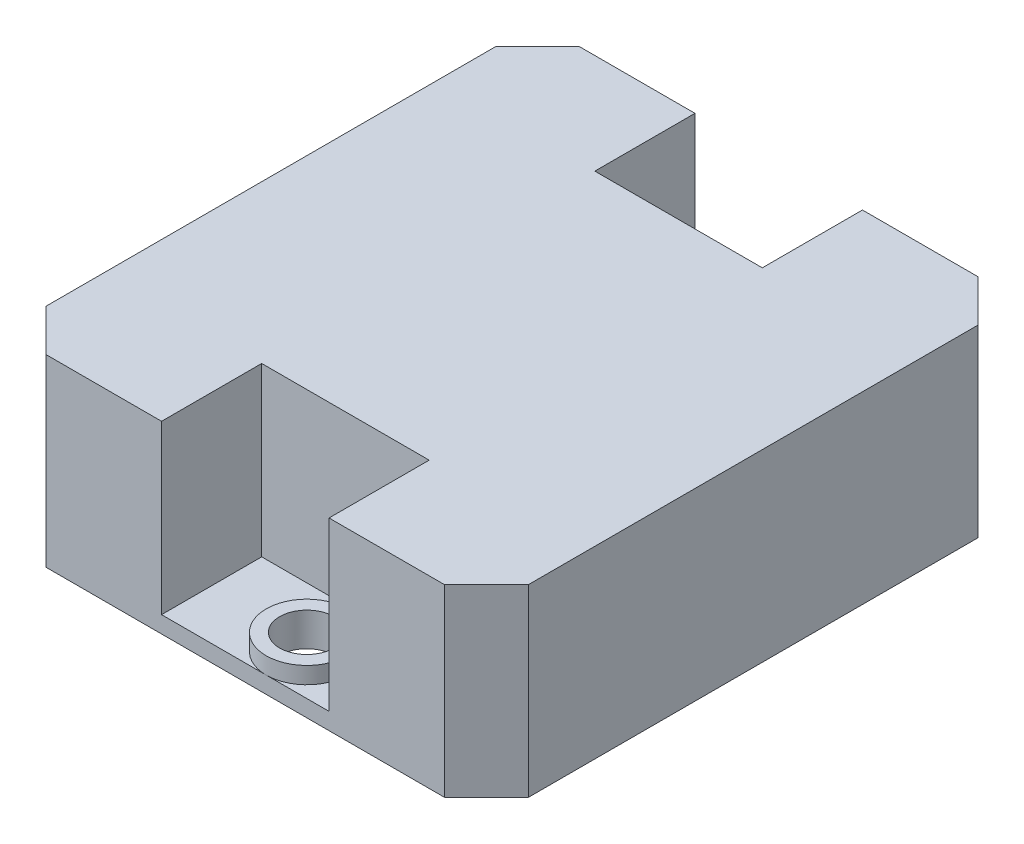
ISO-10303-21;
HEADER;
FILE_DESCRIPTION(('STEP AP214'),'2;1');
FILE_NAME('part.step','',(''),(''),'','','');
FILE_SCHEMA(('AUTOMOTIVE_DESIGN { 1 0 10303 214 1 1 1 1 }'));
ENDSEC;
DATA;
#1=APPLICATION_CONTEXT('core data for automotive mechanical design processes');
#2=APPLICATION_PROTOCOL_DEFINITION('international standard','automotive_design',2000,#1);
#3=PRODUCT_CONTEXT('',#1,'mechanical');
#4=PRODUCT('Part','Part','',(#3));
#5=PRODUCT_RELATED_PRODUCT_CATEGORY('part','',(#4));
#6=PRODUCT_DEFINITION_FORMATION('','',#4);
#7=PRODUCT_DEFINITION_CONTEXT('part definition',#1,'design');
#8=PRODUCT_DEFINITION('design','',#6,#7);
#9=PRODUCT_DEFINITION_SHAPE('','',#8);
#10=(LENGTH_UNIT() NAMED_UNIT(*) SI_UNIT(.MILLI.,.METRE.));
#11=(NAMED_UNIT(*) PLANE_ANGLE_UNIT() SI_UNIT($,.RADIAN.));
#12=(NAMED_UNIT(*) SI_UNIT($,.STERADIAN.) SOLID_ANGLE_UNIT());
#13=UNCERTAINTY_MEASURE_WITH_UNIT(LENGTH_MEASURE(1.E-05),#10,'distance_accuracy_value','');
#14=(GEOMETRIC_REPRESENTATION_CONTEXT(3) GLOBAL_UNCERTAINTY_ASSIGNED_CONTEXT((#13)) GLOBAL_UNIT_ASSIGNED_CONTEXT((#10,
#11,#12)) REPRESENTATION_CONTEXT('',''));
#15=CARTESIAN_POINT('',(0.,0.,0.));
#16=DIRECTION('',(0.,0.,1.));
#17=DIRECTION('',(1.,0.,0.));
#18=AXIS2_PLACEMENT_3D('',#15,#16,#17);
#19=CARTESIAN_POINT('',(2.5,22.,-27.));
#20=DIRECTION('',(0.,-1.,0.));
#21=DIRECTION('',(0.,0.,-1.));
#22=AXIS2_PLACEMENT_3D('',#19,#20,#21);
#23=CYLINDRICAL_SURFACE('',#22,3.25);
#24=CARTESIAN_POINT('',(2.5,0.,-27.));
#25=DIRECTION('',(0.,1.,0.));
#26=DIRECTION('',(0.,0.,1.));
#27=AXIS2_PLACEMENT_3D('',#24,#25,#26);
#28=CIRCLE('',#27,3.25);
#29=CARTESIAN_POINT('',(2.5,0.,-23.75));
#30=VERTEX_POINT('',#29);
#31=EDGE_CURVE('E215',#30,#30,#28,.T.);
#32=ORIENTED_EDGE('',*,*,#31,.F.);
#33=EDGE_LOOP('',(#32));
#34=FACE_BOUND('',#33,.T.);
#35=CARTESIAN_POINT('',(2.5,4.,-27.));
#36=DIRECTION('',(0.,1.,0.));
#37=DIRECTION('',(0.,0.,1.));
#38=AXIS2_PLACEMENT_3D('',#35,#36,#37);
#39=CIRCLE('',#38,3.25);
#40=CARTESIAN_POINT('',(2.5,4.,-23.75));
#41=VERTEX_POINT('',#40);
#42=EDGE_CURVE('E293',#41,#41,#39,.T.);
#43=ORIENTED_EDGE('',*,*,#42,.T.);
#44=EDGE_LOOP('',(#43));
#45=FACE_BOUND('',#44,.T.);
#46=ADVANCED_FACE('F37',(#34,#45),#23,.F.);
#47=CARTESIAN_POINT('',(2.5,22.,27.));
#48=DIRECTION('',(0.,-1.,0.));
#49=DIRECTION('',(0.,0.,-1.));
#50=AXIS2_PLACEMENT_3D('',#47,#48,#49);
#51=CYLINDRICAL_SURFACE('',#50,3.25);
#52=CARTESIAN_POINT('',(2.5,0.,27.));
#53=DIRECTION('',(0.,1.,0.));
#54=DIRECTION('',(0.,0.,-1.));
#55=AXIS2_PLACEMENT_3D('',#52,#53,#54);
#56=CIRCLE('',#55,3.25);
#57=CARTESIAN_POINT('',(2.5,0.,23.75));
#58=VERTEX_POINT('',#57);
#59=EDGE_CURVE('E189',#58,#58,#56,.T.);
#60=ORIENTED_EDGE('',*,*,#59,.F.);
#61=EDGE_LOOP('',(#60));
#62=FACE_BOUND('',#61,.T.);
#63=CARTESIAN_POINT('',(2.5,4.,27.));
#64=DIRECTION('',(0.,1.,0.));
#65=DIRECTION('',(0.,0.,1.));
#66=AXIS2_PLACEMENT_3D('',#63,#64,#65);
#67=CIRCLE('',#66,3.25);
#68=CARTESIAN_POINT('',(2.5,4.,30.25));
#69=VERTEX_POINT('',#68);
#70=EDGE_CURVE('E193',#69,#69,#67,.T.);
#71=ORIENTED_EDGE('',*,*,#70,.T.);
#72=EDGE_LOOP('',(#71));
#73=FACE_BOUND('',#72,.T.);
#74=ADVANCED_FACE('F379',(#62,#73),#51,.F.);
#75=CARTESIAN_POINT('',(2.5,2.,27.));
#76=DIRECTION('',(0.,1.,0.));
#77=DIRECTION('',(0.,0.,1.));
#78=AXIS2_PLACEMENT_3D('',#75,#76,#77);
#79=CYLINDRICAL_SURFACE('',#78,4.85000000000001);
#80=CARTESIAN_POINT('',(2.5,2.,27.));
#81=DIRECTION('',(0.,1.,0.));
#82=DIRECTION('',(0.,0.,1.));
#83=AXIS2_PLACEMENT_3D('',#80,#81,#82);
#84=CIRCLE('',#83,4.85000000000001);
#85=CARTESIAN_POINT('',(2.5,2.,31.85));
#86=VERTEX_POINT('',#85);
#87=EDGE_CURVE('E186',#86,#86,#84,.T.);
#88=ORIENTED_EDGE('',*,*,#87,.T.);
#89=EDGE_LOOP('',(#88));
#90=FACE_BOUND('',#89,.T.);
#91=CARTESIAN_POINT('',(2.5,4.,27.));
#92=DIRECTION('',(0.,1.,0.));
#93=DIRECTION('',(0.,0.,1.));
#94=AXIS2_PLACEMENT_3D('',#91,#92,#93);
#95=CIRCLE('',#94,4.85000000000001);
#96=CARTESIAN_POINT('',(2.5,4.,31.85));
#97=VERTEX_POINT('',#96);
#98=EDGE_CURVE('E41',#97,#97,#95,.F.);
#99=ORIENTED_EDGE('',*,*,#98,.T.);
#100=EDGE_LOOP('',(#99));
#101=FACE_BOUND('',#100,.T.);
#102=ADVANCED_FACE('F305',(#90,#101),#79,.T.);
#103=CARTESIAN_POINT('',(2.5,2.,-27.));
#104=DIRECTION('',(0.,1.,0.));
#105=DIRECTION('',(0.,0.,1.));
#106=AXIS2_PLACEMENT_3D('',#103,#104,#105);
#107=CYLINDRICAL_SURFACE('',#106,4.85);
#108=CARTESIAN_POINT('',(2.5,2.,-27.));
#109=DIRECTION('',(0.,1.,0.));
#110=DIRECTION('',(0.,0.,1.));
#111=AXIS2_PLACEMENT_3D('',#108,#109,#110);
#112=CIRCLE('',#111,4.85);
#113=CARTESIAN_POINT('',(2.5,2.,-31.85));
#114=VERTEX_POINT('',#113);
#115=EDGE_CURVE('E54',#114,#114,#112,.T.);
#116=ORIENTED_EDGE('',*,*,#115,.T.);
#117=EDGE_LOOP('',(#116));
#118=FACE_BOUND('',#117,.T.);
#119=CARTESIAN_POINT('',(2.5,4.,-27.));
#120=DIRECTION('',(0.,1.,0.));
#121=DIRECTION('',(0.,0.,1.));
#122=AXIS2_PLACEMENT_3D('',#119,#120,#121);
#123=CIRCLE('',#122,4.85);
#124=CARTESIAN_POINT('',(2.5,4.,-22.15));
#125=VERTEX_POINT('',#124);
#126=EDGE_CURVE('E291',#125,#125,#123,.F.);
#127=ORIENTED_EDGE('',*,*,#126,.T.);
#128=EDGE_LOOP('',(#127));
#129=FACE_BOUND('',#128,.T.);
#130=ADVANCED_FACE('F392',(#118,#129),#107,.T.);
#131=CARTESIAN_POINT('',(0.,22.,0.));
#132=DIRECTION('',(0.,-1.,0.));
#133=DIRECTION('',(0.,0.,-1.));
#134=AXIS2_PLACEMENT_3D('',#131,#132,#133);
#135=PLANE('',#134);
#136=DIRECTION('',(1.,0.,0.));
#137=VECTOR('',#136,1.);
#138=CARTESIAN_POINT('',(-23.8,22.,31.85));
#139=LINE('',#138,#137);
#140=CARTESIAN_POINT('',(-23.8,22.,31.85));
#141=VERTEX_POINT('',#140);
#142=CARTESIAN_POINT('',(-10.,22.,31.85));
#143=VERTEX_POINT('',#142);
#144=EDGE_CURVE('E230',#141,#143,#139,.T.);
#145=ORIENTED_EDGE('',*,*,#144,.T.);
#146=DIRECTION('',(0.,0.,1.));
#147=VECTOR('',#146,1.);
#148=CARTESIAN_POINT('',(-10.,22.,31.85));
#149=LINE('',#148,#147);
#150=CARTESIAN_POINT('',(-10.,22.,19.8914949727031));
#151=VERTEX_POINT('',#150);
#152=EDGE_CURVE('E167',#151,#143,#149,.T.);
#153=ORIENTED_EDGE('',*,*,#152,.F.);
#154=DIRECTION('',(-1.,0.,0.));
#155=VECTOR('',#154,1.);
#156=CARTESIAN_POINT('',(-10.,22.,19.8914949727031));
#157=LINE('',#156,#155);
#158=CARTESIAN_POINT('',(10.,22.,19.8914949727031));
#159=VERTEX_POINT('',#158);
#160=EDGE_CURVE('E185',#159,#151,#157,.T.);
#161=ORIENTED_EDGE('',*,*,#160,.F.);
#162=DIRECTION('',(0.,0.,-1.));
#163=VECTOR('',#162,1.);
#164=CARTESIAN_POINT('',(10.,22.,19.8914949727031));
#165=LINE('',#164,#163);
#166=CARTESIAN_POINT('',(10.,22.,31.85));
#167=VERTEX_POINT('',#166);
#168=EDGE_CURVE('E173',#167,#159,#165,.T.);
#169=ORIENTED_EDGE('',*,*,#168,.F.);
#170=CARTESIAN_POINT('',(23.8,22.,31.85));
#171=VERTEX_POINT('',#170);
#172=EDGE_CURVE('E229',#167,#171,#139,.T.);
#173=ORIENTED_EDGE('',*,*,#172,.T.);
#174=DIRECTION('',(0.707106781186548,0.,-0.707106781186548));
#175=VECTOR('',#174,1.);
#176=CARTESIAN_POINT('',(23.8,22.,31.85));
#177=LINE('',#176,#175);
#178=CARTESIAN_POINT('',(28.8,22.,26.85));
#179=VERTEX_POINT('',#178);
#180=EDGE_CURVE('E233',#171,#179,#177,.T.);
#181=ORIENTED_EDGE('',*,*,#180,.T.);
#182=DIRECTION('',(0.,0.,-1.));
#183=VECTOR('',#182,1.);
#184=CARTESIAN_POINT('',(28.8,22.,-26.85));
#185=LINE('',#184,#183);
#186=CARTESIAN_POINT('',(28.8,22.,-26.85));
#187=VERTEX_POINT('',#186);
#188=EDGE_CURVE('E235',#179,#187,#185,.T.);
#189=ORIENTED_EDGE('',*,*,#188,.T.);
#190=DIRECTION('',(-0.707106781186548,0.,-0.707106781186548));
#191=VECTOR('',#190,1.);
#192=CARTESIAN_POINT('',(23.8,22.,-31.85));
#193=LINE('',#192,#191);
#194=CARTESIAN_POINT('',(23.8,22.,-31.85));
#195=VERTEX_POINT('',#194);
#196=EDGE_CURVE('E237',#187,#195,#193,.T.);
#197=ORIENTED_EDGE('',*,*,#196,.T.);
#198=DIRECTION('',(-1.,0.,0.));
#199=VECTOR('',#198,1.);
#200=CARTESIAN_POINT('',(-23.8,22.,-31.85));
#201=LINE('',#200,#199);
#202=CARTESIAN_POINT('',(10.,22.,-31.85));
#203=VERTEX_POINT('',#202);
#204=EDGE_CURVE('E219',#195,#203,#201,.T.);
#205=ORIENTED_EDGE('',*,*,#204,.T.);
#206=DIRECTION('',(0.,0.,-1.));
#207=VECTOR('',#206,1.);
#208=CARTESIAN_POINT('',(10.,22.,-34.2472614741212));
#209=LINE('',#208,#207);
#210=CARTESIAN_POINT('',(10.,22.,-19.8914949727031));
#211=VERTEX_POINT('',#210);
#212=EDGE_CURVE('E206',#211,#203,#209,.T.);
#213=ORIENTED_EDGE('',*,*,#212,.F.);
#214=DIRECTION('',(1.,0.,0.));
#215=VECTOR('',#214,1.);
#216=CARTESIAN_POINT('',(-9.99999999999999,22.,-19.8914949727031));
#217=LINE('',#216,#215);
#218=CARTESIAN_POINT('',(-9.99999999999999,22.,-19.8914949727031));
#219=VERTEX_POINT('',#218);
#220=EDGE_CURVE('E192',#219,#211,#217,.T.);
#221=ORIENTED_EDGE('',*,*,#220,.F.);
#222=DIRECTION('',(0.,0.,1.));
#223=VECTOR('',#222,1.);
#224=CARTESIAN_POINT('',(-9.99999999999999,22.,-19.8914949727031));
#225=LINE('',#224,#223);
#226=CARTESIAN_POINT('',(-9.99999999999999,22.,-31.85));
#227=VERTEX_POINT('',#226);
#228=EDGE_CURVE('E198',#227,#219,#225,.T.);
#229=ORIENTED_EDGE('',*,*,#228,.F.);
#230=CARTESIAN_POINT('',(-23.8,22.,-31.85));
#231=VERTEX_POINT('',#230);
#232=EDGE_CURVE('E223',#227,#231,#201,.T.);
#233=ORIENTED_EDGE('',*,*,#232,.T.);
#234=DIRECTION('',(-0.707106781186548,0.,0.707106781186548));
#235=VECTOR('',#234,1.);
#236=CARTESIAN_POINT('',(-28.8,22.,-26.85));
#237=LINE('',#236,#235);
#238=CARTESIAN_POINT('',(-28.8,22.,-26.85));
#239=VERTEX_POINT('',#238);
#240=EDGE_CURVE('E222',#231,#239,#237,.T.);
#241=ORIENTED_EDGE('',*,*,#240,.T.);
#242=DIRECTION('',(0.,0.,1.));
#243=VECTOR('',#242,1.);
#244=CARTESIAN_POINT('',(-28.8,22.,-26.85));
#245=LINE('',#244,#243);
#246=CARTESIAN_POINT('',(-28.8,22.,26.85));
#247=VERTEX_POINT('',#246);
#248=EDGE_CURVE('E225',#239,#247,#245,.T.);
#249=ORIENTED_EDGE('',*,*,#248,.T.);
#250=DIRECTION('',(0.707106781186548,0.,0.707106781186548));
#251=VECTOR('',#250,1.);
#252=CARTESIAN_POINT('',(-28.8,22.,26.85));
#253=LINE('',#252,#251);
#254=EDGE_CURVE('E227',#247,#141,#253,.T.);
#255=ORIENTED_EDGE('',*,*,#254,.T.);
#256=EDGE_LOOP('',(#145,#153,#161,#169,#173,#181,#189,#197,#205,#213,#221,#229,#233,#241,#249,#255));
#257=FACE_BOUND('',#256,.T.);
#258=ADVANCED_FACE('F312',(#257),#135,.F.);
#259=CARTESIAN_POINT('',(0.,0.,0.));
#260=DIRECTION('',(0.,-1.,0.));
#261=DIRECTION('',(0.,0.,-1.));
#262=AXIS2_PLACEMENT_3D('',#259,#260,#261);
#263=PLANE('',#262);
#264=ORIENTED_EDGE('',*,*,#31,.T.);
#265=EDGE_LOOP('',(#264));
#266=FACE_BOUND('',#265,.T.);
#267=DIRECTION('',(-1.,0.,0.));
#268=VECTOR('',#267,1.);
#269=CARTESIAN_POINT('',(-23.8,0.,-31.85));
#270=LINE('',#269,#268);
#271=CARTESIAN_POINT('',(23.8,0.,-31.85));
#272=VERTEX_POINT('',#271);
#273=CARTESIAN_POINT('',(-23.8,0.,-31.85));
#274=VERTEX_POINT('',#273);
#275=EDGE_CURVE('E218',#272,#274,#270,.T.);
#276=ORIENTED_EDGE('',*,*,#275,.F.);
#277=DIRECTION('',(-0.707106781186548,0.,-0.707106781186548));
#278=VECTOR('',#277,1.);
#279=CARTESIAN_POINT('',(23.8,0.,-31.85));
#280=LINE('',#279,#278);
#281=CARTESIAN_POINT('',(28.8,0.,-26.85));
#282=VERTEX_POINT('',#281);
#283=EDGE_CURVE('E254',#282,#272,#280,.T.);
#284=ORIENTED_EDGE('',*,*,#283,.F.);
#285=DIRECTION('',(0.,0.,-1.));
#286=VECTOR('',#285,1.);
#287=CARTESIAN_POINT('',(28.8,0.,-26.85));
#288=LINE('',#287,#286);
#289=CARTESIAN_POINT('',(28.8,0.,26.85));
#290=VERTEX_POINT('',#289);
#291=EDGE_CURVE('E252',#290,#282,#288,.T.);
#292=ORIENTED_EDGE('',*,*,#291,.F.);
#293=DIRECTION('',(0.707106781186548,0.,-0.707106781186548));
#294=VECTOR('',#293,1.);
#295=CARTESIAN_POINT('',(23.8,0.,31.85));
#296=LINE('',#295,#294);
#297=CARTESIAN_POINT('',(23.8,0.,31.85));
#298=VERTEX_POINT('',#297);
#299=EDGE_CURVE('E250',#298,#290,#296,.T.);
#300=ORIENTED_EDGE('',*,*,#299,.F.);
#301=DIRECTION('',(1.,0.,0.));
#302=VECTOR('',#301,1.);
#303=CARTESIAN_POINT('',(-23.8,0.,31.85));
#304=LINE('',#303,#302);
#305=CARTESIAN_POINT('',(-23.8,0.,31.85));
#306=VERTEX_POINT('',#305);
#307=EDGE_CURVE('E248',#306,#298,#304,.T.);
#308=ORIENTED_EDGE('',*,*,#307,.F.);
#309=DIRECTION('',(0.707106781186548,0.,0.707106781186548));
#310=VECTOR('',#309,1.);
#311=CARTESIAN_POINT('',(-28.8,0.,26.85));
#312=LINE('',#311,#310);
#313=CARTESIAN_POINT('',(-28.8,0.,26.85));
#314=VERTEX_POINT('',#313);
#315=EDGE_CURVE('E246',#314,#306,#312,.T.);
#316=ORIENTED_EDGE('',*,*,#315,.F.);
#317=DIRECTION('',(0.,0.,1.));
#318=VECTOR('',#317,1.);
#319=CARTESIAN_POINT('',(-28.8,0.,-26.85));
#320=LINE('',#319,#318);
#321=CARTESIAN_POINT('',(-28.8,0.,-26.85));
#322=VERTEX_POINT('',#321);
#323=EDGE_CURVE('E244',#322,#314,#320,.T.);
#324=ORIENTED_EDGE('',*,*,#323,.F.);
#325=DIRECTION('',(-0.707106781186548,0.,0.707106781186548));
#326=VECTOR('',#325,1.);
#327=CARTESIAN_POINT('',(-28.8,0.,-26.85));
#328=LINE('',#327,#326);
#329=EDGE_CURVE('E242',#274,#322,#328,.T.);
#330=ORIENTED_EDGE('',*,*,#329,.F.);
#331=EDGE_LOOP('',(#276,#284,#292,#300,#308,#316,#324,#330));
#332=FACE_BOUND('',#331,.T.);
#333=ORIENTED_EDGE('',*,*,#59,.T.);
#334=EDGE_LOOP('',(#333));
#335=FACE_BOUND('',#334,.T.);
#336=ADVANCED_FACE('F325',(#266,#332,#335),#263,.T.);
#337=CARTESIAN_POINT('',(-23.8,22.,-31.85));
#338=DIRECTION('',(0.,0.,1.));
#339=DIRECTION('',(1.,0.,0.));
#340=AXIS2_PLACEMENT_3D('',#337,#338,#339);
#341=PLANE('',#340);
#342=DIRECTION('',(-1.,0.,0.));
#343=VECTOR('',#342,1.);
#344=CARTESIAN_POINT('',(-23.8,2.,-31.85));
#345=LINE('',#344,#343);
#346=CARTESIAN_POINT('',(10.,2.,-31.85));
#347=VERTEX_POINT('',#346);
#348=EDGE_CURVE('E46',#347,#114,#345,.T.);
#349=ORIENTED_EDGE('',*,*,#348,.F.);
#350=DIRECTION('',(0.,1.,0.));
#351=VECTOR('',#350,1.);
#352=CARTESIAN_POINT('',(9.99999999999999,22.,-31.85));
#353=LINE('',#352,#351);
#354=EDGE_CURVE('E11',#347,#203,#353,.T.);
#355=ORIENTED_EDGE('',*,*,#354,.T.);
#356=ORIENTED_EDGE('',*,*,#204,.F.);
#357=DIRECTION('',(0.,-1.,0.));
#358=VECTOR('',#357,1.);
#359=CARTESIAN_POINT('',(23.8,22.,-31.85));
#360=LINE('',#359,#358);
#361=EDGE_CURVE('E239',#195,#272,#360,.T.);
#362=ORIENTED_EDGE('',*,*,#361,.T.);
#363=ORIENTED_EDGE('',*,*,#275,.T.);
#364=DIRECTION('',(0.,-1.,0.));
#365=VECTOR('',#364,1.);
#366=CARTESIAN_POINT('',(-23.8,22.,-31.85));
#367=LINE('',#366,#365);
#368=EDGE_CURVE('E276',#231,#274,#367,.T.);
#369=ORIENTED_EDGE('',*,*,#368,.F.);
#370=ORIENTED_EDGE('',*,*,#232,.F.);
#371=DIRECTION('',(0.,-1.,0.));
#372=VECTOR('',#371,1.);
#373=CARTESIAN_POINT('',(-9.99999999999999,22.,-31.85));
#374=LINE('',#373,#372);
#375=CARTESIAN_POINT('',(-9.99999999999999,2.,-31.85));
#376=VERTEX_POINT('',#375);
#377=EDGE_CURVE('E289',#227,#376,#374,.T.);
#378=ORIENTED_EDGE('',*,*,#377,.T.);
#379=EDGE_CURVE('E287',#114,#376,#345,.T.);
#380=ORIENTED_EDGE('',*,*,#379,.F.);
#381=EDGE_LOOP('',(#349,#355,#356,#362,#363,#369,#370,#378,#380));
#382=FACE_BOUND('',#381,.T.);
#383=ADVANCED_FACE('F39',(#382),#341,.F.);
#384=CARTESIAN_POINT('',(-28.8,22.,-26.85));
#385=DIRECTION('',(0.707106781186548,0.,0.707106781186548));
#386=DIRECTION('',(0.707106781186548,0.,-0.707106781186548));
#387=AXIS2_PLACEMENT_3D('',#384,#385,#386);
#388=PLANE('',#387);
#389=ORIENTED_EDGE('',*,*,#329,.T.);
#390=DIRECTION('',(0.,-1.,0.));
#391=VECTOR('',#390,1.);
#392=CARTESIAN_POINT('',(-28.8,22.,-26.85));
#393=LINE('',#392,#391);
#394=EDGE_CURVE('E273',#239,#322,#393,.T.);
#395=ORIENTED_EDGE('',*,*,#394,.F.);
#396=ORIENTED_EDGE('',*,*,#240,.F.);
#397=ORIENTED_EDGE('',*,*,#368,.T.);
#398=EDGE_LOOP('',(#389,#395,#396,#397));
#399=FACE_BOUND('',#398,.T.);
#400=ADVANCED_FACE('F363',(#399),#388,.F.);
#401=CARTESIAN_POINT('',(-28.8,22.,-26.85));
#402=DIRECTION('',(1.,0.,0.));
#403=DIRECTION('',(0.,0.,-1.));
#404=AXIS2_PLACEMENT_3D('',#401,#402,#403);
#405=PLANE('',#404);
#406=ORIENTED_EDGE('',*,*,#323,.T.);
#407=DIRECTION('',(0.,-1.,0.));
#408=VECTOR('',#407,1.);
#409=CARTESIAN_POINT('',(-28.8,22.,26.85));
#410=LINE('',#409,#408);
#411=EDGE_CURVE('E270',#247,#314,#410,.T.);
#412=ORIENTED_EDGE('',*,*,#411,.F.);
#413=ORIENTED_EDGE('',*,*,#248,.F.);
#414=ORIENTED_EDGE('',*,*,#394,.T.);
#415=EDGE_LOOP('',(#406,#412,#413,#414));
#416=FACE_BOUND('',#415,.T.);
#417=ADVANCED_FACE('F368',(#416),#405,.F.);
#418=CARTESIAN_POINT('',(-28.8,22.,26.85));
#419=DIRECTION('',(0.707106781186548,0.,-0.707106781186548));
#420=DIRECTION('',(-0.707106781186548,0.,-0.707106781186548));
#421=AXIS2_PLACEMENT_3D('',#418,#419,#420);
#422=PLANE('',#421);
#423=ORIENTED_EDGE('',*,*,#315,.T.);
#424=DIRECTION('',(0.,-1.,0.));
#425=VECTOR('',#424,1.);
#426=CARTESIAN_POINT('',(-23.8,22.,31.85));
#427=LINE('',#426,#425);
#428=EDGE_CURVE('E267',#141,#306,#427,.T.);
#429=ORIENTED_EDGE('',*,*,#428,.F.);
#430=ORIENTED_EDGE('',*,*,#254,.F.);
#431=ORIENTED_EDGE('',*,*,#411,.T.);
#432=EDGE_LOOP('',(#423,#429,#430,#431));
#433=FACE_BOUND('',#432,.T.);
#434=ADVANCED_FACE('F369',(#433),#422,.F.);
#435=CARTESIAN_POINT('',(-23.8,22.,31.85));
#436=DIRECTION('',(0.,0.,-1.));
#437=DIRECTION('',(-1.,0.,0.));
#438=AXIS2_PLACEMENT_3D('',#435,#436,#437);
#439=PLANE('',#438);
#440=ORIENTED_EDGE('',*,*,#172,.F.);
#441=DIRECTION('',(0.,-1.,0.));
#442=VECTOR('',#441,1.);
#443=CARTESIAN_POINT('',(10.,22.,31.85));
#444=LINE('',#443,#442);
#445=CARTESIAN_POINT('',(10.,2.,31.85));
#446=VERTEX_POINT('',#445);
#447=EDGE_CURVE('E285',#167,#446,#444,.T.);
#448=ORIENTED_EDGE('',*,*,#447,.T.);
#449=DIRECTION('',(-1.,0.,0.));
#450=VECTOR('',#449,1.);
#451=CARTESIAN_POINT('',(-23.8,2.,31.85));
#452=LINE('',#451,#450);
#453=EDGE_CURVE('E164',#446,#86,#452,.T.);
#454=ORIENTED_EDGE('',*,*,#453,.T.);
#455=CARTESIAN_POINT('',(-10.,2.,31.85));
#456=VERTEX_POINT('',#455);
#457=EDGE_CURVE('E279',#86,#456,#452,.T.);
#458=ORIENTED_EDGE('',*,*,#457,.T.);
#459=DIRECTION('',(0.,1.,0.));
#460=VECTOR('',#459,1.);
#461=CARTESIAN_POINT('',(-10.,22.,31.85));
#462=LINE('',#461,#460);
#463=EDGE_CURVE('E282',#456,#143,#462,.T.);
#464=ORIENTED_EDGE('',*,*,#463,.T.);
#465=ORIENTED_EDGE('',*,*,#144,.F.);
#466=ORIENTED_EDGE('',*,*,#428,.T.);
#467=ORIENTED_EDGE('',*,*,#307,.T.);
#468=DIRECTION('',(0.,-1.,0.));
#469=VECTOR('',#468,1.);
#470=CARTESIAN_POINT('',(23.8,22.,31.85));
#471=LINE('',#470,#469);
#472=EDGE_CURVE('E264',#171,#298,#471,.T.);
#473=ORIENTED_EDGE('',*,*,#472,.F.);
#474=EDGE_LOOP('',(#440,#448,#454,#458,#464,#465,#466,#467,#473));
#475=FACE_BOUND('',#474,.T.);
#476=ADVANCED_FACE('F309',(#475),#439,.F.);
#477=CARTESIAN_POINT('',(23.8,22.,31.85));
#478=DIRECTION('',(-0.707106781186548,0.,-0.707106781186548));
#479=DIRECTION('',(-0.707106781186548,0.,0.707106781186548));
#480=AXIS2_PLACEMENT_3D('',#477,#478,#479);
#481=PLANE('',#480);
#482=ORIENTED_EDGE('',*,*,#299,.T.);
#483=DIRECTION('',(0.,-1.,0.));
#484=VECTOR('',#483,1.);
#485=CARTESIAN_POINT('',(28.8,22.,26.85));
#486=LINE('',#485,#484);
#487=EDGE_CURVE('E261',#179,#290,#486,.T.);
#488=ORIENTED_EDGE('',*,*,#487,.F.);
#489=ORIENTED_EDGE('',*,*,#180,.F.);
#490=ORIENTED_EDGE('',*,*,#472,.T.);
#491=EDGE_LOOP('',(#482,#488,#489,#490));
#492=FACE_BOUND('',#491,.T.);
#493=ADVANCED_FACE('F332',(#492),#481,.F.);
#494=CARTESIAN_POINT('',(28.8,22.,-26.85));
#495=DIRECTION('',(-1.,0.,0.));
#496=DIRECTION('',(0.,0.,1.));
#497=AXIS2_PLACEMENT_3D('',#494,#495,#496);
#498=PLANE('',#497);
#499=ORIENTED_EDGE('',*,*,#291,.T.);
#500=DIRECTION('',(0.,-1.,0.));
#501=VECTOR('',#500,1.);
#502=CARTESIAN_POINT('',(28.8,22.,-26.85));
#503=LINE('',#502,#501);
#504=EDGE_CURVE('E258',#187,#282,#503,.T.);
#505=ORIENTED_EDGE('',*,*,#504,.F.);
#506=ORIENTED_EDGE('',*,*,#188,.F.);
#507=ORIENTED_EDGE('',*,*,#487,.T.);
#508=EDGE_LOOP('',(#499,#505,#506,#507));
#509=FACE_BOUND('',#508,.T.);
#510=ADVANCED_FACE('F336',(#509),#498,.F.);
#511=CARTESIAN_POINT('',(23.8,22.,-31.85));
#512=DIRECTION('',(-0.707106781186548,0.,0.707106781186548));
#513=DIRECTION('',(0.707106781186548,0.,0.707106781186548));
#514=AXIS2_PLACEMENT_3D('',#511,#512,#513);
#515=PLANE('',#514);
#516=ORIENTED_EDGE('',*,*,#283,.T.);
#517=ORIENTED_EDGE('',*,*,#361,.F.);
#518=ORIENTED_EDGE('',*,*,#196,.F.);
#519=ORIENTED_EDGE('',*,*,#504,.T.);
#520=EDGE_LOOP('',(#516,#517,#518,#519));
#521=FACE_BOUND('',#520,.T.);
#522=ADVANCED_FACE('F343',(#521),#515,.F.);
#523=CARTESIAN_POINT('',(-10.,2.,31.85));
#524=DIRECTION('',(-1.,0.,0.));
#525=DIRECTION('',(0.,0.,1.));
#526=AXIS2_PLACEMENT_3D('',#523,#524,#525);
#527=PLANE('',#526);
#528=DIRECTION('',(0.,0.,1.));
#529=VECTOR('',#528,1.);
#530=CARTESIAN_POINT('',(-10.,2.,19.8914949727031));
#531=LINE('',#530,#529);
#532=CARTESIAN_POINT('',(-10.,2.,19.8914949727031));
#533=VERTEX_POINT('',#532);
#534=EDGE_CURVE('E61',#533,#456,#531,.T.);
#535=ORIENTED_EDGE('',*,*,#534,.F.);
#536=DIRECTION('',(0.,1.,0.));
#537=VECTOR('',#536,1.);
#538=CARTESIAN_POINT('',(-10.,2.,19.8914949727031));
#539=LINE('',#538,#537);
#540=EDGE_CURVE('E177',#533,#151,#539,.T.);
#541=ORIENTED_EDGE('',*,*,#540,.T.);
#542=ORIENTED_EDGE('',*,*,#152,.T.);
#543=ORIENTED_EDGE('',*,*,#463,.F.);
#544=EDGE_LOOP('',(#535,#541,#542,#543));
#545=FACE_BOUND('',#544,.T.);
#546=ADVANCED_FACE('F316',(#545),#527,.F.);
#547=CARTESIAN_POINT('',(10.,2.,19.8914949727031));
#548=DIRECTION('',(1.,0.,0.));
#549=DIRECTION('',(0.,0.,-1.));
#550=AXIS2_PLACEMENT_3D('',#547,#548,#549);
#551=PLANE('',#550);
#552=ORIENTED_EDGE('',*,*,#168,.T.);
#553=DIRECTION('',(0.,1.,0.));
#554=VECTOR('',#553,1.);
#555=CARTESIAN_POINT('',(10.,2.,19.8914949727031));
#556=LINE('',#555,#554);
#557=CARTESIAN_POINT('',(10.,2.,19.8914949727031));
#558=VERTEX_POINT('',#557);
#559=EDGE_CURVE('E170',#558,#159,#556,.T.);
#560=ORIENTED_EDGE('',*,*,#559,.F.);
#561=DIRECTION('',(0.,0.,-1.));
#562=VECTOR('',#561,1.);
#563=CARTESIAN_POINT('',(10.,2.,34.308434642832));
#564=LINE('',#563,#562);
#565=EDGE_CURVE('E157',#446,#558,#564,.T.);
#566=ORIENTED_EDGE('',*,*,#565,.F.);
#567=ORIENTED_EDGE('',*,*,#447,.F.);
#568=EDGE_LOOP('',(#552,#560,#566,#567));
#569=FACE_BOUND('',#568,.T.);
#570=ADVANCED_FACE('F171',(#569),#551,.F.);
#571=CARTESIAN_POINT('',(0.,2.,0.));
#572=DIRECTION('',(0.,-1.,0.));
#573=DIRECTION('',(0.,0.,-1.));
#574=AXIS2_PLACEMENT_3D('',#571,#572,#573);
#575=PLANE('',#574);
#576=ORIENTED_EDGE('',*,*,#565,.T.);
#577=DIRECTION('',(-1.,0.,0.));
#578=VECTOR('',#577,1.);
#579=CARTESIAN_POINT('',(-10.,2.,19.8914949727031));
#580=LINE('',#579,#578);
#581=EDGE_CURVE('E161',#558,#533,#580,.T.);
#582=ORIENTED_EDGE('',*,*,#581,.T.);
#583=ORIENTED_EDGE('',*,*,#534,.T.);
#584=ORIENTED_EDGE('',*,*,#457,.F.);
#585=ORIENTED_EDGE('',*,*,#87,.F.);
#586=ORIENTED_EDGE('',*,*,#453,.F.);
#587=EDGE_LOOP('',(#576,#582,#583,#584,#585,#586));
#588=FACE_BOUND('',#587,.T.);
#589=ADVANCED_FACE('F159',(#588),#575,.F.);
#590=CARTESIAN_POINT('',(-10.,2.,19.8914949727031));
#591=DIRECTION('',(0.,0.,-1.));
#592=DIRECTION('',(-1.,0.,0.));
#593=AXIS2_PLACEMENT_3D('',#590,#591,#592);
#594=PLANE('',#593);
#595=ORIENTED_EDGE('',*,*,#160,.T.);
#596=ORIENTED_EDGE('',*,*,#540,.F.);
#597=ORIENTED_EDGE('',*,*,#581,.F.);
#598=ORIENTED_EDGE('',*,*,#559,.T.);
#599=EDGE_LOOP('',(#595,#596,#597,#598));
#600=FACE_BOUND('',#599,.T.);
#601=ADVANCED_FACE('F179',(#600),#594,.F.);
#602=CARTESIAN_POINT('',(-9.99999999999999,2.,-19.8914949727031));
#603=DIRECTION('',(-1.,0.,0.));
#604=DIRECTION('',(0.,0.,1.));
#605=AXIS2_PLACEMENT_3D('',#602,#603,#604);
#606=PLANE('',#605);
#607=ORIENTED_EDGE('',*,*,#228,.T.);
#608=DIRECTION('',(0.,1.,0.));
#609=VECTOR('',#608,1.);
#610=CARTESIAN_POINT('',(-9.99999999999999,2.,-19.8914949727031));
#611=LINE('',#610,#609);
#612=CARTESIAN_POINT('',(-9.99999999999999,2.,-19.8914949727031));
#613=VERTEX_POINT('',#612);
#614=EDGE_CURVE('E209',#613,#219,#611,.T.);
#615=ORIENTED_EDGE('',*,*,#614,.F.);
#616=DIRECTION('',(0.,0.,1.));
#617=VECTOR('',#616,1.);
#618=CARTESIAN_POINT('',(-9.99999999999999,2.,-31.85));
#619=LINE('',#618,#617);
#620=EDGE_CURVE('E201',#376,#613,#619,.T.);
#621=ORIENTED_EDGE('',*,*,#620,.F.);
#622=ORIENTED_EDGE('',*,*,#377,.F.);
#623=EDGE_LOOP('',(#607,#615,#621,#622));
#624=FACE_BOUND('',#623,.T.);
#625=ADVANCED_FACE('F438',(#624),#606,.F.);
#626=CARTESIAN_POINT('',(10.,2.,-34.2472614741212));
#627=DIRECTION('',(1.,0.,0.));
#628=DIRECTION('',(0.,0.,-1.));
#629=AXIS2_PLACEMENT_3D('',#626,#627,#628);
#630=PLANE('',#629);
#631=DIRECTION('',(0.,0.,-1.));
#632=VECTOR('',#631,1.);
#633=CARTESIAN_POINT('',(10.,2.,-19.8914949727031));
#634=LINE('',#633,#632);
#635=CARTESIAN_POINT('',(10.,2.,-19.8914949727031));
#636=VERTEX_POINT('',#635);
#637=EDGE_CURVE('E197',#636,#347,#634,.T.);
#638=ORIENTED_EDGE('',*,*,#637,.F.);
#639=DIRECTION('',(0.,1.,0.));
#640=VECTOR('',#639,1.);
#641=CARTESIAN_POINT('',(10.,2.,-19.8914949727031));
#642=LINE('',#641,#640);
#643=EDGE_CURVE('E203',#636,#211,#642,.T.);
#644=ORIENTED_EDGE('',*,*,#643,.T.);
#645=ORIENTED_EDGE('',*,*,#212,.T.);
#646=ORIENTED_EDGE('',*,*,#354,.F.);
#647=EDGE_LOOP('',(#638,#644,#645,#646));
#648=FACE_BOUND('',#647,.T.);
#649=ADVANCED_FACE('F349',(#648),#630,.F.);
#650=CARTESIAN_POINT('',(0.,2.,0.));
#651=DIRECTION('',(0.,1.,0.));
#652=DIRECTION('',(0.,0.,1.));
#653=AXIS2_PLACEMENT_3D('',#650,#651,#652);
#654=PLANE('',#653);
#655=ORIENTED_EDGE('',*,*,#348,.T.);
#656=ORIENTED_EDGE('',*,*,#115,.F.);
#657=ORIENTED_EDGE('',*,*,#379,.T.);
#658=ORIENTED_EDGE('',*,*,#620,.T.);
#659=DIRECTION('',(1.,0.,0.));
#660=VECTOR('',#659,1.);
#661=CARTESIAN_POINT('',(-9.99999999999999,2.,-19.8914949727031));
#662=LINE('',#661,#660);
#663=EDGE_CURVE('E194',#613,#636,#662,.T.);
#664=ORIENTED_EDGE('',*,*,#663,.T.);
#665=ORIENTED_EDGE('',*,*,#637,.T.);
#666=EDGE_LOOP('',(#655,#656,#657,#658,#664,#665));
#667=FACE_BOUND('',#666,.T.);
#668=ADVANCED_FACE('F350',(#667),#654,.T.);
#669=CARTESIAN_POINT('',(-9.99999999999999,2.,-19.8914949727031));
#670=DIRECTION('',(0.,0.,1.));
#671=DIRECTION('',(1.,0.,0.));
#672=AXIS2_PLACEMENT_3D('',#669,#670,#671);
#673=PLANE('',#672);
#674=ORIENTED_EDGE('',*,*,#220,.T.);
#675=ORIENTED_EDGE('',*,*,#643,.F.);
#676=ORIENTED_EDGE('',*,*,#663,.F.);
#677=ORIENTED_EDGE('',*,*,#614,.T.);
#678=EDGE_LOOP('',(#674,#675,#676,#677));
#679=FACE_BOUND('',#678,.T.);
#680=ADVANCED_FACE('F355',(#679),#673,.F.);
#681=CARTESIAN_POINT('',(2.5,4.,-27.));
#682=DIRECTION('',(0.,1.,0.));
#683=DIRECTION('',(0.,0.,1.));
#684=AXIS2_PLACEMENT_3D('',#681,#682,#683);
#685=PLANE('',#684);
#686=ORIENTED_EDGE('',*,*,#42,.F.);
#687=EDGE_LOOP('',(#686));
#688=FACE_BOUND('',#687,.T.);
#689=ORIENTED_EDGE('',*,*,#126,.F.);
#690=EDGE_LOOP('',(#689));
#691=FACE_BOUND('',#690,.T.);
#692=ADVANCED_FACE('F463',(#688,#691),#685,.T.);
#693=CARTESIAN_POINT('',(2.5,4.,27.));
#694=DIRECTION('',(0.,1.,0.));
#695=DIRECTION('',(0.,0.,1.));
#696=AXIS2_PLACEMENT_3D('',#693,#694,#695);
#697=PLANE('',#696);
#698=ORIENTED_EDGE('',*,*,#70,.F.);
#699=EDGE_LOOP('',(#698));
#700=FACE_BOUND('',#699,.T.);
#701=ORIENTED_EDGE('',*,*,#98,.F.);
#702=EDGE_LOOP('',(#701));
#703=FACE_BOUND('',#702,.T.);
#704=ADVANCED_FACE('F469',(#700,#703),#697,.T.);
#705=CLOSED_SHELL('',(#46,#74,#102,#130,#258,#336,#383,#400,#417,#434,#476,#493,#510,#522,#546,
#570,#589,#601,#625,#649,#668,#680,#692,#704));
#706=MANIFOLD_SOLID_BREP('B2',#705);
#707=ADVANCED_BREP_SHAPE_REPRESENTATION('',(#18,#706),#14);
#708=SHAPE_DEFINITION_REPRESENTATION(#9,#707);
ENDSEC;
END-ISO-10303-21;
